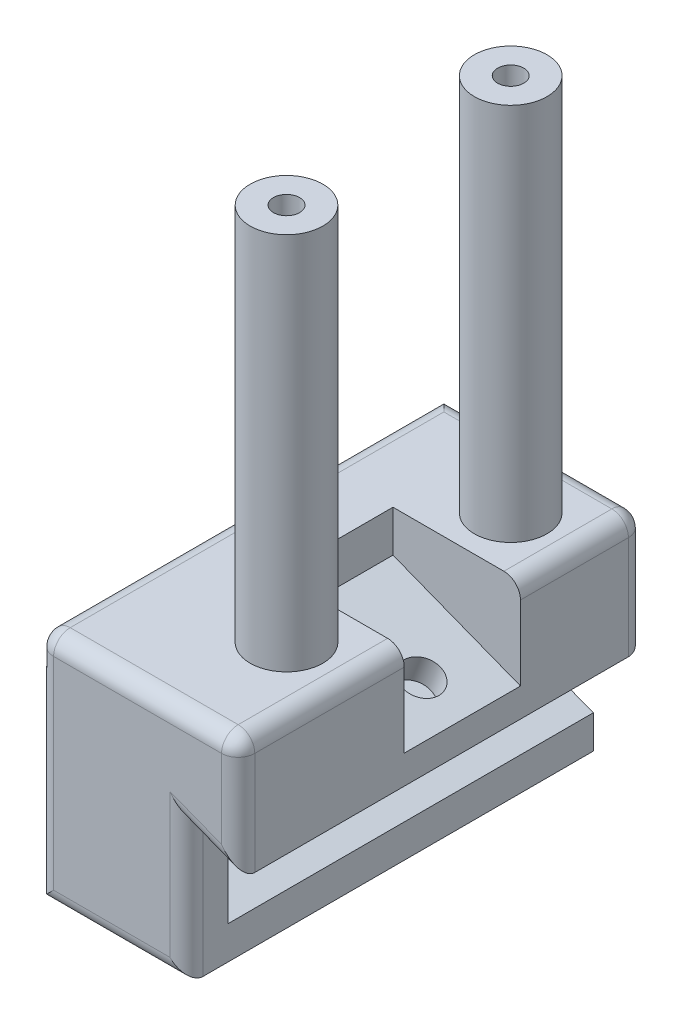
ISO-10303-21;
HEADER;
FILE_DESCRIPTION(('STEP AP214'),'2;1');
FILE_NAME('part.step','',(''),(''),'','','');
FILE_SCHEMA(('AUTOMOTIVE_DESIGN { 1 0 10303 214 1 1 1 1 }'));
ENDSEC;
DATA;
#1=APPLICATION_CONTEXT('core data for automotive mechanical design processes');
#2=APPLICATION_PROTOCOL_DEFINITION('international standard','automotive_design',2000,#1);
#3=PRODUCT_CONTEXT('',#1,'mechanical');
#4=PRODUCT('Part','Part','',(#3));
#5=PRODUCT_RELATED_PRODUCT_CATEGORY('part','',(#4));
#6=PRODUCT_DEFINITION_FORMATION('','',#4);
#7=PRODUCT_DEFINITION_CONTEXT('part definition',#1,'design');
#8=PRODUCT_DEFINITION('design','',#6,#7);
#9=PRODUCT_DEFINITION_SHAPE('','',#8);
#10=(LENGTH_UNIT() NAMED_UNIT(*) SI_UNIT(.MILLI.,.METRE.));
#11=(NAMED_UNIT(*) PLANE_ANGLE_UNIT() SI_UNIT($,.RADIAN.));
#12=(NAMED_UNIT(*) SI_UNIT($,.STERADIAN.) SOLID_ANGLE_UNIT());
#13=UNCERTAINTY_MEASURE_WITH_UNIT(LENGTH_MEASURE(1.E-05),#10,'distance_accuracy_value','');
#14=(GEOMETRIC_REPRESENTATION_CONTEXT(3) GLOBAL_UNCERTAINTY_ASSIGNED_CONTEXT((#13)) GLOBAL_UNIT_ASSIGNED_CONTEXT((#10,
#11,#12)) REPRESENTATION_CONTEXT('',''));
#15=CARTESIAN_POINT('',(0.,0.,0.));
#16=DIRECTION('',(0.,0.,1.));
#17=DIRECTION('',(1.,0.,0.));
#18=AXIS2_PLACEMENT_3D('',#15,#16,#17);
#19=CARTESIAN_POINT('',(21.0231138310347,93.9544851801877,10.795));
#20=DIRECTION('',(0.,-1.,0.));
#21=DIRECTION('',(0.,0.,-1.));
#22=AXIS2_PLACEMENT_3D('',#19,#20,#21);
#23=CYLINDRICAL_SURFACE('',#22,5.55625);
#24=CARTESIAN_POINT('',(21.0231138310347,36.0424851801877,10.795));
#25=DIRECTION('',(0.,1.,0.));
#26=DIRECTION('',(0.,0.,1.));
#27=AXIS2_PLACEMENT_3D('',#24,#25,#26);
#28=CIRCLE('',#27,5.55625);
#29=CARTESIAN_POINT('',(21.0231138310347,36.0424851801877,16.35125));
#30=VERTEX_POINT('',#29);
#31=EDGE_CURVE('E222',#30,#30,#28,.T.);
#32=ORIENTED_EDGE('',*,*,#31,.T.);
#33=EDGE_LOOP('',(#32));
#34=FACE_BOUND('',#33,.T.);
#35=CARTESIAN_POINT('',(21.0231138310347,93.9544851801877,10.795));
#36=DIRECTION('',(0.,1.,0.));
#37=DIRECTION('',(0.,0.,1.));
#38=AXIS2_PLACEMENT_3D('',#35,#36,#37);
#39=CIRCLE('',#38,5.55625);
#40=CARTESIAN_POINT('',(21.0231138310347,93.9544851801877,16.35125));
#41=VERTEX_POINT('',#40);
#42=EDGE_CURVE('E296',#41,#41,#39,.T.);
#43=ORIENTED_EDGE('',*,*,#42,.F.);
#44=EDGE_LOOP('',(#43));
#45=FACE_BOUND('',#44,.T.);
#46=ADVANCED_FACE('F43',(#34,#45),#23,.T.);
#47=CARTESIAN_POINT('',(21.0231138310347,93.9544851801877,10.795));
#48=DIRECTION('',(0.,1.,0.));
#49=DIRECTION('',(0.,0.,1.));
#50=AXIS2_PLACEMENT_3D('',#47,#48,#49);
#51=PLANE('',#50);
#52=CARTESIAN_POINT('',(21.0231138310347,93.9544851801877,10.795));
#53=DIRECTION('',(0.,1.,0.));
#54=DIRECTION('',(0.,0.,1.));
#55=AXIS2_PLACEMENT_3D('',#52,#53,#54);
#56=CIRCLE('',#55,1.999996);
#57=CARTESIAN_POINT('',(21.0231138310347,93.9544851801877,12.794996));
#58=VERTEX_POINT('',#57);
#59=EDGE_CURVE('E232',#58,#58,#56,.T.);
#60=ORIENTED_EDGE('',*,*,#59,.F.);
#61=EDGE_LOOP('',(#60));
#62=FACE_BOUND('',#61,.T.);
#63=ORIENTED_EDGE('',*,*,#42,.T.);
#64=EDGE_LOOP('',(#63));
#65=FACE_BOUND('',#64,.T.);
#66=ADVANCED_FACE('F504',(#62,#65),#51,.T.);
#67=CARTESIAN_POINT('',(21.0231138310347,86.9544852101877,10.795));
#68=DIRECTION('',(0.,1.,0.));
#69=DIRECTION('',(0.,0.,1.));
#70=AXIS2_PLACEMENT_3D('',#67,#68,#69);
#71=CYLINDRICAL_SURFACE('',#70,1.999996);
#72=CARTESIAN_POINT('',(21.0231138310347,86.9544852101877,10.795));
#73=DIRECTION('',(0.,1.,0.));
#74=DIRECTION('',(0.,0.,1.));
#75=AXIS2_PLACEMENT_3D('',#72,#73,#74);
#76=CIRCLE('',#75,1.999996);
#77=CARTESIAN_POINT('',(21.0231138310347,86.9544852101877,12.794996));
#78=VERTEX_POINT('',#77);
#79=EDGE_CURVE('E228',#78,#78,#76,.T.);
#80=ORIENTED_EDGE('',*,*,#79,.F.);
#81=EDGE_LOOP('',(#80));
#82=FACE_BOUND('',#81,.T.);
#83=ORIENTED_EDGE('',*,*,#59,.T.);
#84=EDGE_LOOP('',(#83));
#85=FACE_BOUND('',#84,.T.);
#86=ADVANCED_FACE('F512',(#82,#85),#71,.F.);
#87=CARTESIAN_POINT('',(21.0231138310347,86.9544852101877,10.795));
#88=DIRECTION('',(0.,1.,0.));
#89=DIRECTION('',(0.,0.,1.));
#90=AXIS2_PLACEMENT_3D('',#87,#88,#89);
#91=PLANE('',#90);
#92=ORIENTED_EDGE('',*,*,#79,.T.);
#93=EDGE_LOOP('',(#92));
#94=FACE_BOUND('',#93,.T.);
#95=ADVANCED_FACE('F641',(#94),#91,.T.);
#96=CARTESIAN_POINT('',(11.2714334077757,36.0424851801877,36.83));
#97=DIRECTION('',(-1.,0.,0.));
#98=DIRECTION('',(0.,0.,1.));
#99=AXIS2_PLACEMENT_3D('',#96,#97,#98);
#100=PLANE('',#99);
#101=DIRECTION('',(0.,0.,-1.));
#102=VECTOR('',#101,1.);
#103=CARTESIAN_POINT('',(11.2714334077757,29.6924851801877,55.88));
#104=LINE('',#103,#102);
#105=CARTESIAN_POINT('',(11.2714334077757,29.6924851801877,36.83));
#106=VERTEX_POINT('',#105);
#107=CARTESIAN_POINT('',(11.2714334077757,29.6924851801877,19.05));
#108=VERTEX_POINT('',#107);
#109=EDGE_CURVE('E253',#106,#108,#104,.T.);
#110=ORIENTED_EDGE('',*,*,#109,.T.);
#111=DIRECTION('',(0.,-1.,0.));
#112=VECTOR('',#111,1.);
#113=CARTESIAN_POINT('',(11.2714334077757,36.0424851801877,19.05));
#114=LINE('',#113,#112);
#115=CARTESIAN_POINT('',(11.2714334077757,36.0424851801877,19.05));
#116=VERTEX_POINT('',#115);
#117=EDGE_CURVE('E210',#116,#108,#114,.T.);
#118=ORIENTED_EDGE('',*,*,#117,.F.);
#119=DIRECTION('',(0.,0.,-1.));
#120=VECTOR('',#119,1.);
#121=CARTESIAN_POINT('',(11.2714334077757,36.0424851801877,36.83));
#122=LINE('',#121,#120);
#123=CARTESIAN_POINT('',(11.2714334077757,36.0424851801877,36.83));
#124=VERTEX_POINT('',#123);
#125=EDGE_CURVE('E194',#124,#116,#122,.T.);
#126=ORIENTED_EDGE('',*,*,#125,.F.);
#127=DIRECTION('',(0.,-1.,0.));
#128=VECTOR('',#127,1.);
#129=CARTESIAN_POINT('',(11.2714334077757,36.0424851801877,36.83));
#130=LINE('',#129,#128);
#131=EDGE_CURVE('E203',#124,#106,#130,.T.);
#132=ORIENTED_EDGE('',*,*,#131,.T.);
#133=EDGE_LOOP('',(#110,#118,#126,#132));
#134=FACE_BOUND('',#133,.T.);
#135=ADVANCED_FACE('F212',(#134),#100,.F.);
#136=CARTESIAN_POINT('',(0.,36.0424851801877,0.));
#137=DIRECTION('',(0.,1.,0.));
#138=DIRECTION('',(0.,0.,1.));
#139=AXIS2_PLACEMENT_3D('',#136,#137,#138);
#140=PLANE('',#139);
#141=ORIENTED_EDGE('',*,*,#31,.F.);
#142=EDGE_LOOP('',(#141));
#143=FACE_BOUND('',#142,.T.);
#144=CARTESIAN_POINT('',(21.0231138310346,36.0424851801877,45.085));
#145=DIRECTION('',(0.,1.,0.));
#146=DIRECTION('',(0.,0.,1.));
#147=AXIS2_PLACEMENT_3D('',#144,#145,#146);
#148=CIRCLE('',#147,5.55625);
#149=CARTESIAN_POINT('',(21.0231138310346,36.0424851801877,50.64125));
#150=VERTEX_POINT('',#149);
#151=EDGE_CURVE('E221',#150,#150,#148,.T.);
#152=ORIENTED_EDGE('',*,*,#151,.F.);
#153=EDGE_LOOP('',(#152));
#154=FACE_BOUND('',#153,.T.);
#155=DIRECTION('',(1.,0.,0.));
#156=VECTOR('',#155,1.);
#157=CARTESIAN_POINT('',(11.2714334077757,36.0424851801877,19.05));
#158=LINE('',#157,#156);
#159=CARTESIAN_POINT('',(28.2347942542936,36.0424851801877,19.05));
#160=VERTEX_POINT('',#159);
#161=EDGE_CURVE('E215',#116,#160,#158,.T.);
#162=ORIENTED_EDGE('',*,*,#161,.T.);
#163=DIRECTION('',(0.,0.,-1.));
#164=VECTOR('',#163,1.);
#165=CARTESIAN_POINT('',(28.2347942542936,36.0424851801877,0.));
#166=LINE('',#165,#164);
#167=CARTESIAN_POINT('',(28.2347942542936,36.0424851801877,2.54));
#168=VERTEX_POINT('',#167);
#169=EDGE_CURVE('E334',#160,#168,#166,.T.);
#170=ORIENTED_EDGE('',*,*,#169,.T.);
#171=DIRECTION('',(-1.,0.,0.));
#172=VECTOR('',#171,1.);
#173=CARTESIAN_POINT('',(0.,36.0424851801877,2.54));
#174=LINE('',#173,#172);
#175=CARTESIAN_POINT('',(2.54,36.0424851801877,2.54));
#176=VERTEX_POINT('',#175);
#177=EDGE_CURVE('E332',#168,#176,#174,.T.);
#178=ORIENTED_EDGE('',*,*,#177,.T.);
#179=DIRECTION('',(0.,0.,1.));
#180=VECTOR('',#179,1.);
#181=CARTESIAN_POINT('',(2.54,36.0424851801877,62.23));
#182=LINE('',#181,#180);
#183=CARTESIAN_POINT('',(2.54,36.0424851801877,59.69));
#184=VERTEX_POINT('',#183);
#185=EDGE_CURVE('E330',#176,#184,#182,.T.);
#186=ORIENTED_EDGE('',*,*,#185,.T.);
#187=DIRECTION('',(1.,0.,0.));
#188=VECTOR('',#187,1.);
#189=CARTESIAN_POINT('',(30.7747942542936,36.0424851801877,59.69));
#190=LINE('',#189,#188);
#191=CARTESIAN_POINT('',(28.2347942542936,36.0424851801877,59.69));
#192=VERTEX_POINT('',#191);
#193=EDGE_CURVE('E328',#184,#192,#190,.T.);
#194=ORIENTED_EDGE('',*,*,#193,.T.);
#195=DIRECTION('',(0.,0.,-1.));
#196=VECTOR('',#195,1.);
#197=CARTESIAN_POINT('',(28.2347942542936,36.0424851801877,0.));
#198=LINE('',#197,#196);
#199=CARTESIAN_POINT('',(28.2347942542936,36.0424851801877,36.83));
#200=VERTEX_POINT('',#199);
#201=EDGE_CURVE('E197',#192,#200,#198,.T.);
#202=ORIENTED_EDGE('',*,*,#201,.T.);
#203=DIRECTION('',(-1.,0.,0.));
#204=VECTOR('',#203,1.);
#205=CARTESIAN_POINT('',(30.7747942542936,36.0424851801877,36.83));
#206=LINE('',#205,#204);
#207=EDGE_CURVE('E189',#200,#124,#206,.T.);
#208=ORIENTED_EDGE('',*,*,#207,.T.);
#209=ORIENTED_EDGE('',*,*,#125,.T.);
#210=EDGE_LOOP('',(#162,#170,#178,#186,#194,#202,#208,#209));
#211=FACE_BOUND('',#210,.T.);
#212=ADVANCED_FACE('F192',(#143,#154,#211),#140,.T.);
#213=CARTESIAN_POINT('',(22.86,5.08,55.88));
#214=DIRECTION('',(-0.362446261154949,-0.932004671541296,0.));
#215=DIRECTION('',(0.932004671541296,-0.362446261154949,0.));
#216=AXIS2_PLACEMENT_3D('',#213,#214,#215);
#217=PLANE('',#216);
#218=DIRECTION('',(-0.932004671541296,0.362446261154949,0.));
#219=VECTOR('',#218,1.);
#220=CARTESIAN_POINT('',(22.86,5.08,0.));
#221=LINE('',#220,#219);
#222=CARTESIAN_POINT('',(22.86,5.08,0.));
#223=VERTEX_POINT('',#222);
#224=CARTESIAN_POINT('',(2.54,12.9822222222222,0.));
#225=VERTEX_POINT('',#224);
#226=EDGE_CURVE('E280',#223,#225,#221,.T.);
#227=ORIENTED_EDGE('',*,*,#226,.T.);
#228=CARTESIAN_POINT('',(2.54,12.9822222222222,2.54));
#229=DIRECTION('',(-0.362446261154949,-0.932004671541296,0.));
#230=DIRECTION('',(0.932004671541296,-0.362446261154949,0.));
#231=AXIS2_PLACEMENT_3D('',#228,#229,#230);
#232=ELLIPSE('',#231,2.72530822812239,2.54);
#233=CARTESIAN_POINT('',(0.,13.97,2.54));
#234=VERTEX_POINT('',#233);
#235=EDGE_CURVE('E358',#225,#234,#232,.F.);
#236=ORIENTED_EDGE('',*,*,#235,.T.);
#237=DIRECTION('',(0.,0.,-1.));
#238=VECTOR('',#237,1.);
#239=CARTESIAN_POINT('',(0.,13.97,55.88));
#240=LINE('',#239,#238);
#241=CARTESIAN_POINT('',(0.,13.97,55.88));
#242=VERTEX_POINT('',#241);
#243=EDGE_CURVE('E279',#242,#234,#240,.T.);
#244=ORIENTED_EDGE('',*,*,#243,.F.);
#245=DIRECTION('',(-0.932004671541296,0.362446261154949,0.));
#246=VECTOR('',#245,1.);
#247=CARTESIAN_POINT('',(22.86,5.08,55.88));
#248=LINE('',#247,#246);
#249=CARTESIAN_POINT('',(22.86,5.08,55.88));
#250=VERTEX_POINT('',#249);
#251=EDGE_CURVE('E276',#250,#242,#248,.T.);
#252=ORIENTED_EDGE('',*,*,#251,.F.);
#253=DIRECTION('',(0.,0.,-1.));
#254=VECTOR('',#253,1.);
#255=CARTESIAN_POINT('',(22.86,5.08,55.88));
#256=LINE('',#255,#254);
#257=EDGE_CURVE('E287',#250,#223,#256,.T.);
#258=ORIENTED_EDGE('',*,*,#257,.T.);
#259=EDGE_LOOP('',(#227,#236,#244,#252,#258));
#260=FACE_BOUND('',#259,.T.);
#261=ADVANCED_FACE('F467',(#260),#217,.F.);
#262=CARTESIAN_POINT('',(0.,0.,0.));
#263=DIRECTION('',(0.,0.,1.));
#264=DIRECTION('',(1.,0.,0.));
#265=AXIS2_PLACEMENT_3D('',#262,#263,#264);
#266=PLANE('',#265);
#267=DIRECTION('',(1.,0.,0.));
#268=VECTOR('',#267,1.);
#269=CARTESIAN_POINT('',(0.,0.,0.));
#270=LINE('',#269,#268);
#271=CARTESIAN_POINT('',(2.54,0.,0.));
#272=VERTEX_POINT('',#271);
#273=CARTESIAN_POINT('',(22.86,0.,0.));
#274=VERTEX_POINT('',#273);
#275=EDGE_CURVE('E275',#272,#274,#270,.T.);
#276=ORIENTED_EDGE('',*,*,#275,.F.);
#277=DIRECTION('',(0.,-1.,0.));
#278=VECTOR('',#277,1.);
#279=CARTESIAN_POINT('',(2.54,0.,0.));
#280=LINE('',#279,#278);
#281=EDGE_CURVE('E60',#272,#225,#280,.F.);
#282=ORIENTED_EDGE('',*,*,#281,.T.);
#283=ORIENTED_EDGE('',*,*,#226,.F.);
#284=DIRECTION('',(0.,1.,0.));
#285=VECTOR('',#284,1.);
#286=CARTESIAN_POINT('',(22.86,0.,0.));
#287=LINE('',#286,#285);
#288=EDGE_CURVE('E282',#274,#223,#287,.T.);
#289=ORIENTED_EDGE('',*,*,#288,.F.);
#290=EDGE_LOOP('',(#276,#282,#283,#289));
#291=FACE_BOUND('',#290,.T.);
#292=ADVANCED_FACE('F464',(#291),#266,.F.);
#293=CARTESIAN_POINT('',(0.,0.,55.88));
#294=DIRECTION('',(0.,1.,0.));
#295=DIRECTION('',(0.,0.,1.));
#296=AXIS2_PLACEMENT_3D('',#293,#294,#295);
#297=PLANE('',#296);
#298=DIRECTION('',(0.,0.,-1.));
#299=VECTOR('',#298,1.);
#300=CARTESIAN_POINT('',(22.86,0.,55.88));
#301=LINE('',#300,#299);
#302=CARTESIAN_POINT('',(22.86,0.,59.69));
#303=VERTEX_POINT('',#302);
#304=EDGE_CURVE('E290',#303,#274,#301,.T.);
#305=ORIENTED_EDGE('',*,*,#304,.F.);
#306=DIRECTION('',(1.,0.,0.));
#307=VECTOR('',#306,1.);
#308=CARTESIAN_POINT('',(0.,0.,59.69));
#309=LINE('',#308,#307);
#310=CARTESIAN_POINT('',(0.,0.,59.69));
#311=VERTEX_POINT('',#310);
#312=EDGE_CURVE('E352',#303,#311,#309,.F.);
#313=ORIENTED_EDGE('',*,*,#312,.T.);
#314=DIRECTION('',(0.,0.,-1.));
#315=VECTOR('',#314,1.);
#316=CARTESIAN_POINT('',(0.,0.,55.88));
#317=LINE('',#316,#315);
#318=CARTESIAN_POINT('',(0.,0.,2.54));
#319=VERTEX_POINT('',#318);
#320=EDGE_CURVE('E293',#311,#319,#317,.T.);
#321=ORIENTED_EDGE('',*,*,#320,.T.);
#322=CARTESIAN_POINT('',(2.54,0.,2.54));
#323=DIRECTION('',(0.,1.,0.));
#324=DIRECTION('',(0.,0.,1.));
#325=AXIS2_PLACEMENT_3D('',#322,#323,#324);
#326=CIRCLE('',#325,2.54);
#327=EDGE_CURVE('E350',#319,#272,#326,.F.);
#328=ORIENTED_EDGE('',*,*,#327,.T.);
#329=ORIENTED_EDGE('',*,*,#275,.T.);
#330=EDGE_LOOP('',(#305,#313,#321,#328,#329));
#331=FACE_BOUND('',#330,.T.);
#332=ADVANCED_FACE('F462',(#331),#297,.F.);
#333=CARTESIAN_POINT('',(22.86,0.,55.88));
#334=DIRECTION('',(-1.,0.,0.));
#335=DIRECTION('',(0.,0.,1.));
#336=AXIS2_PLACEMENT_3D('',#333,#334,#335);
#337=PLANE('',#336);
#338=DIRECTION('',(0.,0.,-1.));
#339=VECTOR('',#338,1.);
#340=CARTESIAN_POINT('',(22.86,20.8024851801877,76.5783938715696));
#341=LINE('',#340,#339);
#342=CARTESIAN_POINT('',(22.86,20.8024851801877,59.69));
#343=VERTEX_POINT('',#342);
#344=CARTESIAN_POINT('',(22.86,20.8024851801877,55.88));
#345=VERTEX_POINT('',#344);
#346=EDGE_CURVE('E225',#343,#345,#341,.T.);
#347=ORIENTED_EDGE('',*,*,#346,.F.);
#348=DIRECTION('',(0.,1.,0.));
#349=VECTOR('',#348,1.);
#350=CARTESIAN_POINT('',(22.86,0.,59.69));
#351=LINE('',#350,#349);
#352=EDGE_CURVE('E348',#343,#303,#351,.F.);
#353=ORIENTED_EDGE('',*,*,#352,.T.);
#354=ORIENTED_EDGE('',*,*,#304,.T.);
#355=ORIENTED_EDGE('',*,*,#288,.T.);
#356=ORIENTED_EDGE('',*,*,#257,.F.);
#357=DIRECTION('',(0.,1.,0.));
#358=VECTOR('',#357,1.);
#359=CARTESIAN_POINT('',(22.86,29.6924851801877,55.88));
#360=LINE('',#359,#358);
#361=EDGE_CURVE('E267',#250,#345,#360,.T.);
#362=ORIENTED_EDGE('',*,*,#361,.T.);
#363=EDGE_LOOP('',(#347,#353,#354,#355,#356,#362));
#364=FACE_BOUND('',#363,.T.);
#365=ADVANCED_FACE('F466',(#364),#337,.F.);
#366=CARTESIAN_POINT('',(0.,0.,55.88));
#367=DIRECTION('',(0.,0.,-1.));
#368=DIRECTION('',(-1.,0.,0.));
#369=AXIS2_PLACEMENT_3D('',#366,#367,#368);
#370=PLANE('',#369);
#371=DIRECTION('',(0.932004671541296,-0.362446261154949,0.));
#372=VECTOR('',#371,1.);
#373=CARTESIAN_POINT('',(0.,29.6924851801877,55.88));
#374=LINE('',#373,#372);
#375=CARTESIAN_POINT('',(0.,29.6924851801877,55.88));
#376=VERTEX_POINT('',#375);
#377=EDGE_CURVE('E255',#376,#345,#374,.T.);
#378=ORIENTED_EDGE('',*,*,#377,.T.);
#379=ORIENTED_EDGE('',*,*,#361,.F.);
#380=ORIENTED_EDGE('',*,*,#251,.T.);
#381=DIRECTION('',(0.,-1.,0.));
#382=VECTOR('',#381,1.);
#383=CARTESIAN_POINT('',(0.,0.,55.88));
#384=LINE('',#383,#382);
#385=EDGE_CURVE('E272',#376,#242,#384,.T.);
#386=ORIENTED_EDGE('',*,*,#385,.F.);
#387=EDGE_LOOP('',(#378,#379,#380,#386));
#388=FACE_BOUND('',#387,.T.);
#389=ADVANCED_FACE('F453',(#388),#370,.T.);
#390=CARTESIAN_POINT('',(13.0133914586429,-5.06215223391671,27.94));
#391=DIRECTION('',(0.362446261154949,0.932004671541296,0.));
#392=DIRECTION('',(-0.932004671541296,0.362446261154949,0.));
#393=AXIS2_PLACEMENT_3D('',#390,#391,#392);
#394=CYLINDRICAL_SURFACE('',#393,2.8575);
#395=CARTESIAN_POINT('',(23.0440298841219,20.7309180030292,27.94));
#396=DIRECTION('',(-0.362446261154949,-0.932004671541296,0.));
#397=DIRECTION('',(0.932004671541296,-0.362446261154949,0.));
#398=AXIS2_PLACEMENT_3D('',#395,#396,#397);
#399=CIRCLE('',#398,2.8575);
#400=CARTESIAN_POINT('',(25.7072332330512,19.6952278117789,27.94));
#401=VERTEX_POINT('',#400);
#402=EDGE_CURVE('E243',#401,#401,#399,.F.);
#403=ORIENTED_EDGE('',*,*,#402,.F.);
#404=EDGE_LOOP('',(#403));
#405=FACE_BOUND('',#404,.T.);
#406=CARTESIAN_POINT('',(24.5247275703981,24.5384263391679,27.94));
#407=DIRECTION('',(0.362446261154949,0.932004671541296,0.));
#408=DIRECTION('',(-0.932004671541296,0.362446261154949,0.));
#409=AXIS2_PLACEMENT_3D('',#406,#407,#408);
#410=CIRCLE('',#409,2.8575);
#411=CARTESIAN_POINT('',(21.8615242214688,25.5741165304182,27.94));
#412=VERTEX_POINT('',#411);
#413=EDGE_CURVE('E242',#412,#412,#410,.T.);
#414=ORIENTED_EDGE('',*,*,#413,.T.);
#415=EDGE_LOOP('',(#414));
#416=FACE_BOUND('',#415,.T.);
#417=ADVANCED_FACE('F713',(#405,#416),#394,.F.);
#418=CARTESIAN_POINT('',(0.,0.,36.83));
#419=DIRECTION('',(0.,0.,1.));
#420=DIRECTION('',(1.,0.,0.));
#421=AXIS2_PLACEMENT_3D('',#418,#419,#420);
#422=PLANE('',#421);
#423=ORIENTED_EDGE('',*,*,#207,.F.);
#424=CARTESIAN_POINT('',(28.2347942542936,33.5024851801877,36.83));
#425=DIRECTION('',(0.,0.,1.));
#426=DIRECTION('',(1.,0.,0.));
#427=AXIS2_PLACEMENT_3D('',#424,#425,#426);
#428=CIRCLE('',#427,2.54);
#429=CARTESIAN_POINT('',(30.7747942542936,33.5024851801877,36.83));
#430=VERTEX_POINT('',#429);
#431=EDGE_CURVE('E11',#200,#430,#428,.F.);
#432=ORIENTED_EDGE('',*,*,#431,.T.);
#433=DIRECTION('',(0.,1.,0.));
#434=VECTOR('',#433,1.);
#435=CARTESIAN_POINT('',(30.7747942542936,22.1078448509863,36.83));
#436=LINE('',#435,#434);
#437=CARTESIAN_POINT('',(30.7747942542936,22.1078448509863,36.83));
#438=VERTEX_POINT('',#437);
#439=EDGE_CURVE('E249',#438,#430,#436,.T.);
#440=ORIENTED_EDGE('',*,*,#439,.F.);
#441=DIRECTION('',(0.932004671541296,-0.362446261154949,0.));
#442=VECTOR('',#441,1.);
#443=CARTESIAN_POINT('',(11.2714334077757,29.6924851801877,36.83));
#444=LINE('',#443,#442);
#445=EDGE_CURVE('E206',#106,#438,#444,.T.);
#446=ORIENTED_EDGE('',*,*,#445,.F.);
#447=ORIENTED_EDGE('',*,*,#131,.F.);
#448=EDGE_LOOP('',(#423,#432,#440,#446,#447));
#449=FACE_BOUND('',#448,.T.);
#450=ADVANCED_FACE('F204',(#449),#422,.F.);
#451=CARTESIAN_POINT('',(30.7747942542936,22.1078448509863,55.88));
#452=DIRECTION('',(-0.362446261154949,-0.932004671541296,0.));
#453=DIRECTION('',(0.932004671541296,-0.362446261154949,0.));
#454=AXIS2_PLACEMENT_3D('',#451,#452,#453);
#455=PLANE('',#454);
#456=ORIENTED_EDGE('',*,*,#413,.F.);
#457=EDGE_LOOP('',(#456));
#458=FACE_BOUND('',#457,.T.);
#459=DIRECTION('',(0.,0.,-1.));
#460=VECTOR('',#459,1.);
#461=CARTESIAN_POINT('',(30.7747942542936,22.1078448509863,55.88));
#462=LINE('',#461,#460);
#463=CARTESIAN_POINT('',(30.7747942542936,22.1078448509863,19.05));
#464=VERTEX_POINT('',#463);
#465=EDGE_CURVE('E252',#438,#464,#462,.T.);
#466=ORIENTED_EDGE('',*,*,#465,.T.);
#467=DIRECTION('',(0.932004671541296,-0.362446261154949,0.));
#468=VECTOR('',#467,1.);
#469=CARTESIAN_POINT('',(11.5108669428543,29.5993721387683,19.05));
#470=LINE('',#469,#468);
#471=EDGE_CURVE('E301',#108,#464,#470,.T.);
#472=ORIENTED_EDGE('',*,*,#471,.F.);
#473=ORIENTED_EDGE('',*,*,#109,.F.);
#474=ORIENTED_EDGE('',*,*,#445,.T.);
#475=EDGE_LOOP('',(#466,#472,#473,#474));
#476=FACE_BOUND('',#475,.T.);
#477=ADVANCED_FACE('F423',(#458,#476),#455,.F.);
#478=CARTESIAN_POINT('',(0.,0.,19.05));
#479=DIRECTION('',(0.,0.,-1.));
#480=DIRECTION('',(-1.,0.,0.));
#481=AXIS2_PLACEMENT_3D('',#478,#479,#480);
#482=PLANE('',#481);
#483=DIRECTION('',(0.,-1.,0.));
#484=VECTOR('',#483,1.);
#485=CARTESIAN_POINT('',(30.7747942542936,0.,19.05));
#486=LINE('',#485,#484);
#487=CARTESIAN_POINT('',(30.7747942542936,33.5024851801877,19.05));
#488=VERTEX_POINT('',#487);
#489=EDGE_CURVE('E299',#488,#464,#486,.T.);
#490=ORIENTED_EDGE('',*,*,#489,.F.);
#491=CARTESIAN_POINT('',(28.2347942542936,33.5024851801877,19.05));
#492=DIRECTION('',(0.,0.,-1.));
#493=DIRECTION('',(-1.,0.,0.));
#494=AXIS2_PLACEMENT_3D('',#491,#492,#493);
#495=CIRCLE('',#494,2.54);
#496=EDGE_CURVE('E52',#488,#160,#495,.F.);
#497=ORIENTED_EDGE('',*,*,#496,.T.);
#498=ORIENTED_EDGE('',*,*,#161,.F.);
#499=ORIENTED_EDGE('',*,*,#117,.T.);
#500=ORIENTED_EDGE('',*,*,#471,.T.);
#501=EDGE_LOOP('',(#490,#497,#498,#499,#500));
#502=FACE_BOUND('',#501,.T.);
#503=ADVANCED_FACE('F421',(#502),#482,.F.);
#504=CARTESIAN_POINT('',(0.,29.6924851801877,0.));
#505=DIRECTION('',(-0.362446261154949,-0.932004671541296,0.));
#506=DIRECTION('',(0.932004671541296,-0.362446261154949,0.));
#507=AXIS2_PLACEMENT_3D('',#504,#505,#506);
#508=PLANE('',#507);
#509=ORIENTED_EDGE('',*,*,#402,.T.);
#510=EDGE_LOOP('',(#509));
#511=FACE_BOUND('',#510,.T.);
#512=DIRECTION('',(0.,0.,1.));
#513=VECTOR('',#512,1.);
#514=CARTESIAN_POINT('',(30.7747942542936,17.7245096368513,0.));
#515=LINE('',#514,#513);
#516=CARTESIAN_POINT('',(30.7747942542936,17.7245096368513,2.54));
#517=VERTEX_POINT('',#516);
#518=CARTESIAN_POINT('',(30.7747942542936,17.7245096368513,59.69));
#519=VERTEX_POINT('',#518);
#520=EDGE_CURVE('E264',#517,#519,#515,.T.);
#521=ORIENTED_EDGE('',*,*,#520,.T.);
#522=DIRECTION('',(-0.932004671541296,0.362446261154949,0.));
#523=VECTOR('',#522,1.);
#524=CARTESIAN_POINT('',(22.86,20.8024851801877,59.69));
#525=LINE('',#524,#523);
#526=EDGE_CURVE('E346',#519,#343,#525,.T.);
#527=ORIENTED_EDGE('',*,*,#526,.T.);
#528=ORIENTED_EDGE('',*,*,#346,.T.);
#529=ORIENTED_EDGE('',*,*,#377,.F.);
#530=DIRECTION('',(0.,0.,1.));
#531=VECTOR('',#530,1.);
#532=CARTESIAN_POINT('',(0.,29.6924851801877,0.));
#533=LINE('',#532,#531);
#534=CARTESIAN_POINT('',(0.,29.6924851801877,0.));
#535=VERTEX_POINT('',#534);
#536=EDGE_CURVE('E261',#535,#376,#533,.T.);
#537=ORIENTED_EDGE('',*,*,#536,.F.);
#538=DIRECTION('',(0.932004671541296,-0.362446261154949,0.));
#539=VECTOR('',#538,1.);
#540=CARTESIAN_POINT('',(0.,29.6924851801877,0.));
#541=LINE('',#540,#539);
#542=CARTESIAN_POINT('',(28.2347942542936,18.7122874146291,0.));
#543=VERTEX_POINT('',#542);
#544=EDGE_CURVE('E258',#535,#543,#541,.T.);
#545=ORIENTED_EDGE('',*,*,#544,.T.);
#546=CARTESIAN_POINT('',(28.2347942542936,18.7122874146291,2.54));
#547=DIRECTION('',(-0.362446261154949,-0.932004671541296,0.));
#548=DIRECTION('',(0.932004671541296,-0.362446261154949,0.));
#549=AXIS2_PLACEMENT_3D('',#546,#547,#548);
#550=ELLIPSE('',#549,2.72530822812239,2.54);
#551=EDGE_CURVE('E344',#543,#517,#550,.T.);
#552=ORIENTED_EDGE('',*,*,#551,.T.);
#553=EDGE_LOOP('',(#521,#527,#528,#529,#537,#545,#552));
#554=FACE_BOUND('',#553,.T.);
#555=ADVANCED_FACE('F440',(#511,#554),#508,.T.);
#556=CARTESIAN_POINT('',(0.,0.,62.23));
#557=DIRECTION('',(0.,0.,-1.));
#558=DIRECTION('',(-1.,0.,0.));
#559=AXIS2_PLACEMENT_3D('',#556,#557,#558);
#560=PLANE('',#559);
#561=DIRECTION('',(1.,0.,0.));
#562=VECTOR('',#561,1.);
#563=CARTESIAN_POINT('',(0.,33.5024851801877,62.23));
#564=LINE('',#563,#562);
#565=CARTESIAN_POINT('',(28.2347942542936,33.5024851801877,62.23));
#566=VERTEX_POINT('',#565);
#567=CARTESIAN_POINT('',(2.54,33.5024851801877,62.23));
#568=VERTEX_POINT('',#567);
#569=EDGE_CURVE('E314',#566,#568,#564,.F.);
#570=ORIENTED_EDGE('',*,*,#569,.T.);
#571=DIRECTION('',(0.,-1.,0.));
#572=VECTOR('',#571,1.);
#573=CARTESIAN_POINT('',(2.54,0.,62.23));
#574=LINE('',#573,#572);
#575=CARTESIAN_POINT('',(2.54,2.54,62.23));
#576=VERTEX_POINT('',#575);
#577=EDGE_CURVE('E316',#568,#576,#574,.T.);
#578=ORIENTED_EDGE('',*,*,#577,.T.);
#579=DIRECTION('',(1.,0.,0.));
#580=VECTOR('',#579,1.);
#581=CARTESIAN_POINT('',(0.,2.54,62.23));
#582=LINE('',#581,#580);
#583=CARTESIAN_POINT('',(20.32,2.54,62.23));
#584=VERTEX_POINT('',#583);
#585=EDGE_CURVE('E304',#576,#584,#582,.T.);
#586=ORIENTED_EDGE('',*,*,#585,.T.);
#587=DIRECTION('',(0.,1.,0.));
#588=VECTOR('',#587,1.);
#589=CARTESIAN_POINT('',(20.32,0.,62.23));
#590=LINE('',#589,#588);
#591=CARTESIAN_POINT('',(20.32,24.5155711860879,62.23));
#592=VERTEX_POINT('',#591);
#593=EDGE_CURVE('E308',#584,#592,#590,.T.);
#594=ORIENTED_EDGE('',*,*,#593,.T.);
#595=DIRECTION('',(-0.932004671541296,0.362446261154949,0.));
#596=VECTOR('',#595,1.);
#597=CARTESIAN_POINT('',(31.6954077576272,20.0918015025662,62.23));
#598=LINE('',#597,#596);
#599=CARTESIAN_POINT('',(28.2347942542936,21.4375956427515,62.23));
#600=VERTEX_POINT('',#599);
#601=EDGE_CURVE('E310',#592,#600,#598,.F.);
#602=ORIENTED_EDGE('',*,*,#601,.T.);
#603=DIRECTION('',(0.,-1.,0.));
#604=VECTOR('',#603,1.);
#605=CARTESIAN_POINT('',(28.2347942542936,36.0424851801877,62.23));
#606=LINE('',#605,#604);
#607=EDGE_CURVE('E312',#600,#566,#606,.F.);
#608=ORIENTED_EDGE('',*,*,#607,.T.);
#609=EDGE_LOOP('',(#570,#578,#586,#594,#602,#608));
#610=FACE_BOUND('',#609,.T.);
#611=ADVANCED_FACE('F738',(#610),#560,.F.);
#612=CARTESIAN_POINT('',(0.,13.97,55.88));
#613=DIRECTION('',(1.,0.,0.));
#614=DIRECTION('',(0.,1.,0.));
#615=AXIS2_PLACEMENT_3D('',#612,#613,#614);
#616=PLANE('',#615);
#617=ORIENTED_EDGE('',*,*,#243,.T.);
#618=DIRECTION('',(0.,-1.,0.));
#619=VECTOR('',#618,1.);
#620=CARTESIAN_POINT('',(0.,13.97,2.54));
#621=LINE('',#620,#619);
#622=EDGE_CURVE('E324',#234,#319,#621,.T.);
#623=ORIENTED_EDGE('',*,*,#622,.T.);
#624=ORIENTED_EDGE('',*,*,#320,.F.);
#625=DIRECTION('',(0.,-1.,0.));
#626=VECTOR('',#625,1.);
#627=CARTESIAN_POINT('',(0.,13.97,59.69));
#628=LINE('',#627,#626);
#629=CARTESIAN_POINT('',(0.,33.5024851801877,59.69));
#630=VERTEX_POINT('',#629);
#631=EDGE_CURVE('E321',#311,#630,#628,.F.);
#632=ORIENTED_EDGE('',*,*,#631,.T.);
#633=DIRECTION('',(0.,0.,1.));
#634=VECTOR('',#633,1.);
#635=CARTESIAN_POINT('',(0.,33.5024851801877,0.));
#636=LINE('',#635,#634);
#637=CARTESIAN_POINT('',(0.,33.5024851801877,0.));
#638=VERTEX_POINT('',#637);
#639=EDGE_CURVE('E319',#630,#638,#636,.F.);
#640=ORIENTED_EDGE('',*,*,#639,.T.);
#641=DIRECTION('',(0.,-1.,0.));
#642=VECTOR('',#641,1.);
#643=CARTESIAN_POINT('',(0.,36.0424851801877,0.));
#644=LINE('',#643,#642);
#645=EDGE_CURVE('E209',#638,#535,#644,.T.);
#646=ORIENTED_EDGE('',*,*,#645,.T.);
#647=ORIENTED_EDGE('',*,*,#536,.T.);
#648=ORIENTED_EDGE('',*,*,#385,.T.);
#649=EDGE_LOOP('',(#617,#623,#624,#632,#640,#646,#647,#648));
#650=FACE_BOUND('',#649,.T.);
#651=ADVANCED_FACE('F448',(#650),#616,.F.);
#652=CARTESIAN_POINT('',(0.,0.,0.));
#653=DIRECTION('',(0.,0.,-1.));
#654=DIRECTION('',(-1.,0.,0.));
#655=AXIS2_PLACEMENT_3D('',#652,#653,#654);
#656=PLANE('',#655);
#657=DIRECTION('',(-1.,0.,0.));
#658=VECTOR('',#657,1.);
#659=CARTESIAN_POINT('',(0.,33.5024851801877,0.));
#660=LINE('',#659,#658);
#661=CARTESIAN_POINT('',(28.2347942542936,33.5024851801877,0.));
#662=VERTEX_POINT('',#661);
#663=EDGE_CURVE('E68',#638,#662,#660,.F.);
#664=ORIENTED_EDGE('',*,*,#663,.T.);
#665=DIRECTION('',(0.,-1.,0.));
#666=VECTOR('',#665,1.);
#667=CARTESIAN_POINT('',(28.2347942542936,0.,0.));
#668=LINE('',#667,#666);
#669=EDGE_CURVE('E355',#662,#543,#668,.T.);
#670=ORIENTED_EDGE('',*,*,#669,.T.);
#671=ORIENTED_EDGE('',*,*,#544,.F.);
#672=ORIENTED_EDGE('',*,*,#645,.F.);
#673=EDGE_LOOP('',(#664,#670,#671,#672));
#674=FACE_BOUND('',#673,.T.);
#675=ADVANCED_FACE('F446',(#674),#656,.T.);
#676=CARTESIAN_POINT('',(30.7747942542936,0.,19.05));
#677=DIRECTION('',(1.,0.,0.));
#678=DIRECTION('',(0.,0.,-1.));
#679=AXIS2_PLACEMENT_3D('',#676,#677,#678);
#680=PLANE('',#679);
#681=ORIENTED_EDGE('',*,*,#520,.F.);
#682=DIRECTION('',(0.,-1.,0.));
#683=VECTOR('',#682,1.);
#684=CARTESIAN_POINT('',(30.7747942542936,0.,2.54));
#685=LINE('',#684,#683);
#686=CARTESIAN_POINT('',(30.7747942542936,33.5024851801877,2.54));
#687=VERTEX_POINT('',#686);
#688=EDGE_CURVE('E342',#517,#687,#685,.F.);
#689=ORIENTED_EDGE('',*,*,#688,.T.);
#690=DIRECTION('',(0.,0.,-1.));
#691=VECTOR('',#690,1.);
#692=CARTESIAN_POINT('',(30.7747942542936,33.5024851801877,19.05));
#693=LINE('',#692,#691);
#694=EDGE_CURVE('E340',#687,#488,#693,.F.);
#695=ORIENTED_EDGE('',*,*,#694,.T.);
#696=ORIENTED_EDGE('',*,*,#489,.T.);
#697=ORIENTED_EDGE('',*,*,#465,.F.);
#698=ORIENTED_EDGE('',*,*,#439,.T.);
#699=DIRECTION('',(0.,0.,-1.));
#700=VECTOR('',#699,1.);
#701=CARTESIAN_POINT('',(30.7747942542936,33.5024851801877,19.05));
#702=LINE('',#701,#700);
#703=CARTESIAN_POINT('',(30.7747942542936,33.5024851801877,59.69));
#704=VERTEX_POINT('',#703);
#705=EDGE_CURVE('E336',#430,#704,#702,.F.);
#706=ORIENTED_EDGE('',*,*,#705,.T.);
#707=DIRECTION('',(0.,-1.,0.));
#708=VECTOR('',#707,1.);
#709=CARTESIAN_POINT('',(30.7747942542936,17.7245096368513,59.69));
#710=LINE('',#709,#708);
#711=EDGE_CURVE('E338',#704,#519,#710,.T.);
#712=ORIENTED_EDGE('',*,*,#711,.T.);
#713=EDGE_LOOP('',(#681,#689,#695,#696,#697,#698,#706,#712));
#714=FACE_BOUND('',#713,.T.);
#715=ADVANCED_FACE('F418',(#714),#680,.T.);
#716=CARTESIAN_POINT('',(21.0231138310346,86.9544852101877,45.085));
#717=DIRECTION('',(0.,1.,0.));
#718=DIRECTION('',(0.,0.,1.));
#719=AXIS2_PLACEMENT_3D('',#716,#717,#718);
#720=PLANE('',#719);
#721=CARTESIAN_POINT('',(21.0231138310346,86.9544852101877,45.085));
#722=DIRECTION('',(0.,1.,0.));
#723=DIRECTION('',(0.,0.,1.));
#724=AXIS2_PLACEMENT_3D('',#721,#722,#723);
#725=CIRCLE('',#724,1.999996);
#726=CARTESIAN_POINT('',(21.0231138310346,86.9544852101877,47.084996));
#727=VERTEX_POINT('',#726);
#728=EDGE_CURVE('E227',#727,#727,#725,.T.);
#729=ORIENTED_EDGE('',*,*,#728,.T.);
#730=EDGE_LOOP('',(#729));
#731=FACE_BOUND('',#730,.T.);
#732=ADVANCED_FACE('F524',(#731),#720,.T.);
#733=CARTESIAN_POINT('',(21.0231138310346,86.9544852101877,45.085));
#734=DIRECTION('',(0.,1.,0.));
#735=DIRECTION('',(0.,0.,1.));
#736=AXIS2_PLACEMENT_3D('',#733,#734,#735);
#737=CYLINDRICAL_SURFACE('',#736,1.999996);
#738=ORIENTED_EDGE('',*,*,#728,.F.);
#739=EDGE_LOOP('',(#738));
#740=FACE_BOUND('',#739,.T.);
#741=CARTESIAN_POINT('',(21.0231138310346,93.9544851801877,45.085));
#742=DIRECTION('',(0.,1.,0.));
#743=DIRECTION('',(0.,0.,1.));
#744=AXIS2_PLACEMENT_3D('',#741,#742,#743);
#745=CIRCLE('',#744,1.999996);
#746=CARTESIAN_POINT('',(21.0231138310346,93.9544851801877,47.084996));
#747=VERTEX_POINT('',#746);
#748=EDGE_CURVE('E235',#747,#747,#745,.T.);
#749=ORIENTED_EDGE('',*,*,#748,.T.);
#750=EDGE_LOOP('',(#749));
#751=FACE_BOUND('',#750,.T.);
#752=ADVANCED_FACE('F673',(#740,#751),#737,.F.);
#753=CARTESIAN_POINT('',(21.0231138310346,93.9544851801877,45.085));
#754=DIRECTION('',(0.,1.,0.));
#755=DIRECTION('',(0.,0.,1.));
#756=AXIS2_PLACEMENT_3D('',#753,#754,#755);
#757=PLANE('',#756);
#758=ORIENTED_EDGE('',*,*,#748,.F.);
#759=EDGE_LOOP('',(#758));
#760=FACE_BOUND('',#759,.T.);
#761=CARTESIAN_POINT('',(21.0231138310346,93.9544851801877,45.085));
#762=DIRECTION('',(0.,1.,0.));
#763=DIRECTION('',(0.,0.,1.));
#764=AXIS2_PLACEMENT_3D('',#761,#762,#763);
#765=CIRCLE('',#764,5.55625);
#766=CARTESIAN_POINT('',(21.0231138310346,93.9544851801877,50.64125));
#767=VERTEX_POINT('',#766);
#768=EDGE_CURVE('E231',#767,#767,#765,.T.);
#769=ORIENTED_EDGE('',*,*,#768,.T.);
#770=EDGE_LOOP('',(#769));
#771=FACE_BOUND('',#770,.T.);
#772=ADVANCED_FACE('F682',(#760,#771),#757,.T.);
#773=CARTESIAN_POINT('',(21.0231138310346,93.9544851801877,45.085));
#774=DIRECTION('',(0.,-1.,0.));
#775=DIRECTION('',(0.,0.,-1.));
#776=AXIS2_PLACEMENT_3D('',#773,#774,#775);
#777=CYLINDRICAL_SURFACE('',#776,5.55625);
#778=ORIENTED_EDGE('',*,*,#151,.T.);
#779=EDGE_LOOP('',(#778));
#780=FACE_BOUND('',#779,.T.);
#781=ORIENTED_EDGE('',*,*,#768,.F.);
#782=EDGE_LOOP('',(#781));
#783=FACE_BOUND('',#782,.T.);
#784=ADVANCED_FACE('F625',(#780,#783),#777,.T.);
#785=CARTESIAN_POINT('',(28.2347942542936,0.,2.54));
#786=DIRECTION('',(0.,-1.,0.));
#787=DIRECTION('',(0.,0.,-1.));
#788=AXIS2_PLACEMENT_3D('',#785,#786,#787);
#789=CYLINDRICAL_SURFACE('',#788,2.54);
#790=ORIENTED_EDGE('',*,*,#551,.F.);
#791=ORIENTED_EDGE('',*,*,#669,.F.);
#792=CARTESIAN_POINT('',(28.2347942542936,33.5024851801877,2.54));
#793=DIRECTION('',(0.,1.,0.));
#794=DIRECTION('',(0.,0.,1.));
#795=AXIS2_PLACEMENT_3D('',#792,#793,#794);
#796=CIRCLE('',#795,2.54);
#797=EDGE_CURVE('E47',#687,#662,#796,.T.);
#798=ORIENTED_EDGE('',*,*,#797,.F.);
#799=ORIENTED_EDGE('',*,*,#688,.F.);
#800=EDGE_LOOP('',(#790,#791,#798,#799));
#801=FACE_BOUND('',#800,.T.);
#802=ADVANCED_FACE('F445',(#801),#789,.T.);
#803=CARTESIAN_POINT('',(28.2347942542936,33.5024851801877,0.));
#804=DIRECTION('',(0.,0.,-1.));
#805=DIRECTION('',(-1.,0.,0.));
#806=AXIS2_PLACEMENT_3D('',#803,#804,#805);
#807=CYLINDRICAL_SURFACE('',#806,2.54);
#808=ORIENTED_EDGE('',*,*,#496,.F.);
#809=ORIENTED_EDGE('',*,*,#694,.F.);
#810=CARTESIAN_POINT('',(28.2347942542936,33.5024851801877,2.54));
#811=DIRECTION('',(0.,0.,-1.));
#812=DIRECTION('',(-1.,0.,0.));
#813=AXIS2_PLACEMENT_3D('',#810,#811,#812);
#814=CIRCLE('',#813,2.54);
#815=EDGE_CURVE('E394',#168,#687,#814,.T.);
#816=ORIENTED_EDGE('',*,*,#815,.F.);
#817=ORIENTED_EDGE('',*,*,#169,.F.);
#818=EDGE_LOOP('',(#808,#809,#816,#817));
#819=FACE_BOUND('',#818,.T.);
#820=ADVANCED_FACE('F414',(#819),#807,.T.);
#821=CARTESIAN_POINT('',(28.2347942542936,33.5024851801877,2.54));
#822=DIRECTION('',(1.,0.,0.));
#823=DIRECTION('',(0.,0.,-1.));
#824=AXIS2_PLACEMENT_3D('',#821,#822,#823);
#825=SPHERICAL_SURFACE('',#824,2.54);
#826=ORIENTED_EDGE('',*,*,#815,.T.);
#827=ORIENTED_EDGE('',*,*,#797,.T.);
#828=CARTESIAN_POINT('',(28.2347942542936,33.5024851801877,2.54));
#829=DIRECTION('',(1.,0.,0.));
#830=DIRECTION('',(0.,0.,-1.));
#831=AXIS2_PLACEMENT_3D('',#828,#829,#830);
#832=CIRCLE('',#831,2.54);
#833=EDGE_CURVE('E392',#168,#662,#832,.F.);
#834=ORIENTED_EDGE('',*,*,#833,.F.);
#835=EDGE_LOOP('',(#826,#827,#834));
#836=FACE_BOUND('',#835,.T.);
#837=ADVANCED_FACE('F401',(#836),#825,.T.);
#838=CARTESIAN_POINT('',(28.2347942542936,33.5024851801877,0.));
#839=DIRECTION('',(0.,0.,-1.));
#840=DIRECTION('',(-1.,0.,0.));
#841=AXIS2_PLACEMENT_3D('',#838,#839,#840);
#842=CYLINDRICAL_SURFACE('',#841,2.54);
#843=ORIENTED_EDGE('',*,*,#431,.F.);
#844=ORIENTED_EDGE('',*,*,#201,.F.);
#845=CARTESIAN_POINT('',(28.2347942542936,33.5024851801877,59.69));
#846=DIRECTION('',(0.,0.,1.));
#847=DIRECTION('',(1.,0.,0.));
#848=AXIS2_PLACEMENT_3D('',#845,#846,#847);
#849=CIRCLE('',#848,2.54);
#850=EDGE_CURVE('E389',#704,#192,#849,.T.);
#851=ORIENTED_EDGE('',*,*,#850,.F.);
#852=ORIENTED_EDGE('',*,*,#705,.F.);
#853=EDGE_LOOP('',(#843,#844,#851,#852));
#854=FACE_BOUND('',#853,.T.);
#855=ADVANCED_FACE('F428',(#854),#842,.T.);
#856=CARTESIAN_POINT('',(28.2347942542936,0.,59.69));
#857=DIRECTION('',(0.,1.,0.));
#858=DIRECTION('',(0.,0.,1.));
#859=AXIS2_PLACEMENT_3D('',#856,#857,#858);
#860=CYLINDRICAL_SURFACE('',#859,2.54);
#861=CARTESIAN_POINT('',(28.2347942542936,21.4375956427515,59.69));
#862=DIRECTION('',(0.825362423773626,0.564603284990909,0.));
#863=DIRECTION('',(0.564603284990909,-0.825362423773626,0.));
#864=AXIS2_PLACEMENT_3D('',#861,#862,#863);
#865=ELLIPSE('',#864,4.49873400938661,2.54);
#866=EDGE_CURVE('E383',#519,#600,#865,.F.);
#867=ORIENTED_EDGE('',*,*,#866,.F.);
#868=ORIENTED_EDGE('',*,*,#711,.F.);
#869=CARTESIAN_POINT('',(28.2347942542936,33.5024851801877,59.69));
#870=DIRECTION('',(0.,1.,0.));
#871=DIRECTION('',(0.,0.,1.));
#872=AXIS2_PLACEMENT_3D('',#869,#870,#871);
#873=CIRCLE('',#872,2.54);
#874=EDGE_CURVE('E386',#566,#704,#873,.T.);
#875=ORIENTED_EDGE('',*,*,#874,.F.);
#876=ORIENTED_EDGE('',*,*,#607,.F.);
#877=EDGE_LOOP('',(#867,#868,#875,#876));
#878=FACE_BOUND('',#877,.T.);
#879=ADVANCED_FACE('F437',(#878),#860,.T.);
#880=CARTESIAN_POINT('',(0.,33.5024851801877,2.54));
#881=DIRECTION('',(-1.,0.,0.));
#882=DIRECTION('',(0.,0.,1.));
#883=AXIS2_PLACEMENT_3D('',#880,#881,#882);
#884=CYLINDRICAL_SURFACE('',#883,2.54);
#885=ORIENTED_EDGE('',*,*,#833,.T.);
#886=ORIENTED_EDGE('',*,*,#663,.F.);
#887=CARTESIAN_POINT('',(2.54,33.5024851801877,2.54));
#888=DIRECTION('',(0.707106781186547,0.,-0.707106781186547));
#889=DIRECTION('',(-0.707106781186547,0.,-0.707106781186547));
#890=AXIS2_PLACEMENT_3D('',#887,#888,#889);
#891=ELLIPSE('',#890,3.59210244842766,2.54);
#892=EDGE_CURVE('E380',#176,#638,#891,.F.);
#893=ORIENTED_EDGE('',*,*,#892,.F.);
#894=ORIENTED_EDGE('',*,*,#177,.F.);
#895=EDGE_LOOP('',(#885,#886,#893,#894));
#896=FACE_BOUND('',#895,.T.);
#897=ADVANCED_FACE('F406',(#896),#884,.T.);
#898=CARTESIAN_POINT('',(28.2347942542936,33.5024851801877,59.69));
#899=DIRECTION('',(1.,0.,0.));
#900=DIRECTION('',(0.,0.,-1.));
#901=AXIS2_PLACEMENT_3D('',#898,#899,#900);
#902=SPHERICAL_SURFACE('',#901,2.54);
#903=ORIENTED_EDGE('',*,*,#874,.T.);
#904=ORIENTED_EDGE('',*,*,#850,.T.);
#905=CARTESIAN_POINT('',(28.2347942542936,33.5024851801877,59.69));
#906=DIRECTION('',(1.,0.,0.));
#907=DIRECTION('',(0.,0.,-1.));
#908=AXIS2_PLACEMENT_3D('',#905,#906,#907);
#909=CIRCLE('',#908,2.54);
#910=EDGE_CURVE('E377',#566,#192,#909,.F.);
#911=ORIENTED_EDGE('',*,*,#910,.F.);
#912=EDGE_LOOP('',(#903,#904,#911));
#913=FACE_BOUND('',#912,.T.);
#914=ADVANCED_FACE('F432',(#913),#902,.T.);
#915=CARTESIAN_POINT('',(0.920613503333569,32.0597770459026,59.69));
#916=DIRECTION('',(0.932004671541296,-0.362446261154949,0.));
#917=DIRECTION('',(0.362446261154949,0.932004671541296,0.));
#918=AXIS2_PLACEMENT_3D('',#915,#916,#917);
#919=CYLINDRICAL_SURFACE('',#918,2.54);
#920=ORIENTED_EDGE('',*,*,#866,.T.);
#921=ORIENTED_EDGE('',*,*,#601,.F.);
#922=CARTESIAN_POINT('',(20.32,24.5155711860879,59.69));
#923=DIRECTION('',(0.825362423773626,0.564603284990909,0.));
#924=DIRECTION('',(0.564603284990909,-0.825362423773626,0.));
#925=AXIS2_PLACEMENT_3D('',#922,#923,#924);
#926=ELLIPSE('',#925,4.49873400938661,2.54);
#927=EDGE_CURVE('E374',#343,#592,#926,.F.);
#928=ORIENTED_EDGE('',*,*,#927,.F.);
#929=ORIENTED_EDGE('',*,*,#526,.F.);
#930=EDGE_LOOP('',(#920,#921,#928,#929));
#931=FACE_BOUND('',#930,.T.);
#932=ADVANCED_FACE('F472',(#931),#919,.T.);
#933=CARTESIAN_POINT('',(2.54,33.5024851801877,0.));
#934=DIRECTION('',(0.,0.,-1.));
#935=DIRECTION('',(-1.,0.,0.));
#936=AXIS2_PLACEMENT_3D('',#933,#934,#935);
#937=CYLINDRICAL_SURFACE('',#936,2.54);
#938=ORIENTED_EDGE('',*,*,#892,.T.);
#939=ORIENTED_EDGE('',*,*,#639,.F.);
#940=CARTESIAN_POINT('',(2.54,33.5024851801877,59.69));
#941=DIRECTION('',(0.,0.,1.));
#942=DIRECTION('',(1.,0.,0.));
#943=AXIS2_PLACEMENT_3D('',#940,#941,#942);
#944=CIRCLE('',#943,2.54);
#945=EDGE_CURVE('E371',#184,#630,#944,.T.);
#946=ORIENTED_EDGE('',*,*,#945,.F.);
#947=ORIENTED_EDGE('',*,*,#185,.F.);
#948=EDGE_LOOP('',(#938,#939,#946,#947));
#949=FACE_BOUND('',#948,.T.);
#950=ADVANCED_FACE('F492',(#949),#937,.T.);
#951=CARTESIAN_POINT('',(0.,33.5024851801877,59.69));
#952=DIRECTION('',(-1.,0.,0.));
#953=DIRECTION('',(0.,0.,1.));
#954=AXIS2_PLACEMENT_3D('',#951,#952,#953);
#955=CYLINDRICAL_SURFACE('',#954,2.54);
#956=ORIENTED_EDGE('',*,*,#910,.T.);
#957=ORIENTED_EDGE('',*,*,#193,.F.);
#958=CARTESIAN_POINT('',(2.54,33.5024851801877,59.69));
#959=DIRECTION('',(-1.,0.,0.));
#960=DIRECTION('',(0.,0.,1.));
#961=AXIS2_PLACEMENT_3D('',#958,#959,#960);
#962=CIRCLE('',#961,2.54);
#963=EDGE_CURVE('E368',#568,#184,#962,.T.);
#964=ORIENTED_EDGE('',*,*,#963,.F.);
#965=ORIENTED_EDGE('',*,*,#569,.F.);
#966=EDGE_LOOP('',(#956,#957,#964,#965));
#967=FACE_BOUND('',#966,.T.);
#968=ADVANCED_FACE('F494',(#967),#955,.T.);
#969=CARTESIAN_POINT('',(20.32,0.,59.69));
#970=DIRECTION('',(0.,1.,0.));
#971=DIRECTION('',(0.,0.,1.));
#972=AXIS2_PLACEMENT_3D('',#969,#970,#971);
#973=CYLINDRICAL_SURFACE('',#972,2.54);
#974=ORIENTED_EDGE('',*,*,#927,.T.);
#975=ORIENTED_EDGE('',*,*,#593,.F.);
#976=CARTESIAN_POINT('',(20.32,2.54,59.69));
#977=DIRECTION('',(0.707106781186547,0.707106781186547,0.));
#978=DIRECTION('',(0.707106781186547,-0.707106781186547,0.));
#979=AXIS2_PLACEMENT_3D('',#976,#977,#978);
#980=ELLIPSE('',#979,3.59210244842766,2.54);
#981=EDGE_CURVE('E365',#303,#584,#980,.F.);
#982=ORIENTED_EDGE('',*,*,#981,.F.);
#983=ORIENTED_EDGE('',*,*,#352,.F.);
#984=EDGE_LOOP('',(#974,#975,#982,#983));
#985=FACE_BOUND('',#984,.T.);
#986=ADVANCED_FACE('F476',(#985),#973,.T.);
#987=CARTESIAN_POINT('',(2.54,33.5024851801877,59.69));
#988=DIRECTION('',(0.,1.,0.));
#989=DIRECTION('',(0.,0.,1.));
#990=AXIS2_PLACEMENT_3D('',#987,#988,#989);
#991=SPHERICAL_SURFACE('',#990,2.54);
#992=ORIENTED_EDGE('',*,*,#963,.T.);
#993=ORIENTED_EDGE('',*,*,#945,.T.);
#994=CARTESIAN_POINT('',(2.54,33.5024851801877,59.69));
#995=DIRECTION('',(0.,1.,0.));
#996=DIRECTION('',(0.,0.,1.));
#997=AXIS2_PLACEMENT_3D('',#994,#995,#996);
#998=CIRCLE('',#997,2.54);
#999=EDGE_CURVE('E363',#568,#630,#998,.F.);
#1000=ORIENTED_EDGE('',*,*,#999,.F.);
#1001=EDGE_LOOP('',(#992,#993,#1000));
#1002=FACE_BOUND('',#1001,.T.);
#1003=ADVANCED_FACE('F489',(#1002),#991,.T.);
#1004=CARTESIAN_POINT('',(0.,2.54,59.69));
#1005=DIRECTION('',(1.,0.,0.));
#1006=DIRECTION('',(0.,0.,-1.));
#1007=AXIS2_PLACEMENT_3D('',#1004,#1005,#1006);
#1008=CYLINDRICAL_SURFACE('',#1007,2.54);
#1009=ORIENTED_EDGE('',*,*,#981,.T.);
#1010=ORIENTED_EDGE('',*,*,#585,.F.);
#1011=CARTESIAN_POINT('',(2.54,2.54,59.69));
#1012=DIRECTION('',(0.707106781186547,-0.707106781186547,0.));
#1013=DIRECTION('',(0.707106781186547,0.707106781186547,0.));
#1014=AXIS2_PLACEMENT_3D('',#1011,#1012,#1013);
#1015=ELLIPSE('',#1014,3.59210244842766,2.54);
#1016=EDGE_CURVE('E361',#311,#576,#1015,.F.);
#1017=ORIENTED_EDGE('',*,*,#1016,.F.);
#1018=ORIENTED_EDGE('',*,*,#312,.F.);
#1019=EDGE_LOOP('',(#1009,#1010,#1017,#1018));
#1020=FACE_BOUND('',#1019,.T.);
#1021=ADVANCED_FACE('F481',(#1020),#1008,.T.);
#1022=CARTESIAN_POINT('',(2.54,0.,59.69));
#1023=DIRECTION('',(0.,-1.,0.));
#1024=DIRECTION('',(1.,0.,0.));
#1025=AXIS2_PLACEMENT_3D('',#1022,#1023,#1024);
#1026=CYLINDRICAL_SURFACE('',#1025,2.54);
#1027=ORIENTED_EDGE('',*,*,#999,.T.);
#1028=ORIENTED_EDGE('',*,*,#631,.F.);
#1029=ORIENTED_EDGE('',*,*,#1016,.T.);
#1030=ORIENTED_EDGE('',*,*,#577,.F.);
#1031=EDGE_LOOP('',(#1027,#1028,#1029,#1030));
#1032=FACE_BOUND('',#1031,.T.);
#1033=ADVANCED_FACE('F484',(#1032),#1026,.T.);
#1034=CARTESIAN_POINT('',(2.54,13.97,2.54));
#1035=DIRECTION('',(0.,-1.,0.));
#1036=DIRECTION('',(1.,0.,0.));
#1037=AXIS2_PLACEMENT_3D('',#1034,#1035,#1036);
#1038=CYLINDRICAL_SURFACE('',#1037,2.54);
#1039=ORIENTED_EDGE('',*,*,#235,.F.);
#1040=ORIENTED_EDGE('',*,*,#281,.F.);
#1041=ORIENTED_EDGE('',*,*,#327,.F.);
#1042=ORIENTED_EDGE('',*,*,#622,.F.);
#1043=EDGE_LOOP('',(#1039,#1040,#1041,#1042));
#1044=FACE_BOUND('',#1043,.T.);
#1045=ADVANCED_FACE('F45',(#1044),#1038,.T.);
#1046=CLOSED_SHELL('',(#46,#66,#86,#95,#135,#212,#261,#292,#332,#365,#389,#417,#450,#477,#503,
#555,#611,#651,#675,#715,#732,#752,#772,#784,#802,#820,#837,#855,#879,#897,#914,#932,#950,#968,
#986,#1003,#1021,#1033,#1045));
#1047=MANIFOLD_SOLID_BREP('B2',#1046);
#1048=ADVANCED_BREP_SHAPE_REPRESENTATION('',(#18,#1047),#14);
#1049=SHAPE_DEFINITION_REPRESENTATION(#9,#1048);
ENDSEC;
END-ISO-10303-21;
